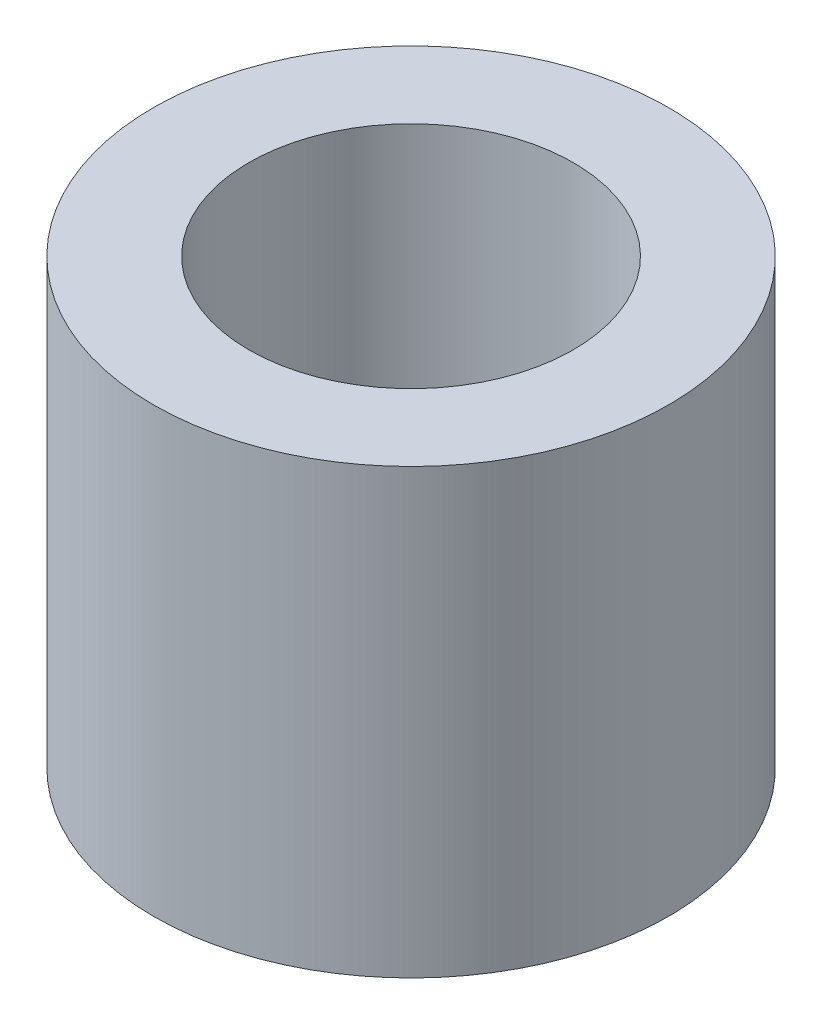
ISO-10303-21;
HEADER;
FILE_DESCRIPTION(('STEP AP214'),'2;1');
FILE_NAME('part.step','',(''),(''),'','','');
FILE_SCHEMA(('AUTOMOTIVE_DESIGN { 1 0 10303 214 1 1 1 1 }'));
ENDSEC;
DATA;
#1=APPLICATION_CONTEXT('core data for automotive mechanical design processes');
#2=APPLICATION_PROTOCOL_DEFINITION('international standard','automotive_design',2000,#1);
#3=PRODUCT_CONTEXT('',#1,'mechanical');
#4=PRODUCT('Part','Part','',(#3));
#5=PRODUCT_RELATED_PRODUCT_CATEGORY('part','',(#4));
#6=PRODUCT_DEFINITION_FORMATION('','',#4);
#7=PRODUCT_DEFINITION_CONTEXT('part definition',#1,'design');
#8=PRODUCT_DEFINITION('design','',#6,#7);
#9=PRODUCT_DEFINITION_SHAPE('','',#8);
#10=(LENGTH_UNIT() NAMED_UNIT(*) SI_UNIT(.MILLI.,.METRE.));
#11=(NAMED_UNIT(*) PLANE_ANGLE_UNIT() SI_UNIT($,.RADIAN.));
#12=(NAMED_UNIT(*) SI_UNIT($,.STERADIAN.) SOLID_ANGLE_UNIT());
#13=UNCERTAINTY_MEASURE_WITH_UNIT(LENGTH_MEASURE(1.E-05),#10,'distance_accuracy_value','');
#14=(GEOMETRIC_REPRESENTATION_CONTEXT(3) GLOBAL_UNCERTAINTY_ASSIGNED_CONTEXT((#13)) GLOBAL_UNIT_ASSIGNED_CONTEXT((#10,
#11,#12)) REPRESENTATION_CONTEXT('',''));
#15=CARTESIAN_POINT('',(0.,0.,0.));
#16=DIRECTION('',(0.,0.,1.));
#17=DIRECTION('',(1.,0.,0.));
#18=AXIS2_PLACEMENT_3D('',#15,#16,#17);
#19=CARTESIAN_POINT('',(0.,10.922,0.));
#20=DIRECTION('',(0.,1.,0.));
#21=DIRECTION('',(0.,0.,1.));
#22=AXIS2_PLACEMENT_3D('',#19,#20,#21);
#23=PLANE('',#22);
#24=CARTESIAN_POINT('',(0.,10.922,0.));
#25=DIRECTION('',(0.,1.,0.));
#26=DIRECTION('',(0.,0.,1.));
#27=AXIS2_PLACEMENT_3D('',#24,#25,#26);
#28=CIRCLE('',#27,6.35);
#29=CARTESIAN_POINT('',(0.,10.922,6.35));
#30=VERTEX_POINT('',#29);
#31=EDGE_CURVE('E12',#30,#30,#28,.T.);
#32=ORIENTED_EDGE('',*,*,#31,.T.);
#33=EDGE_LOOP('',(#32));
#34=FACE_BOUND('',#33,.T.);
#35=CARTESIAN_POINT('',(0.,10.922,0.));
#36=DIRECTION('',(0.,1.,0.));
#37=DIRECTION('',(0.,0.,1.));
#38=AXIS2_PLACEMENT_3D('',#35,#36,#37);
#39=CIRCLE('',#38,4.);
#40=CARTESIAN_POINT('',(0.,10.922,4.));
#41=VERTEX_POINT('',#40);
#42=EDGE_CURVE('E52',#41,#41,#39,.T.);
#43=ORIENTED_EDGE('',*,*,#42,.F.);
#44=EDGE_LOOP('',(#43));
#45=FACE_BOUND('',#44,.T.);
#46=ADVANCED_FACE('F41',(#34,#45),#23,.T.);
#47=CARTESIAN_POINT('',(0.,0.,0.));
#48=DIRECTION('',(0.,1.,0.));
#49=DIRECTION('',(0.,0.,1.));
#50=AXIS2_PLACEMENT_3D('',#47,#48,#49);
#51=PLANE('',#50);
#52=CARTESIAN_POINT('',(0.,0.,0.));
#53=DIRECTION('',(0.,1.,0.));
#54=DIRECTION('',(0.,0.,1.));
#55=AXIS2_PLACEMENT_3D('',#52,#53,#54);
#56=CIRCLE('',#55,6.35);
#57=CARTESIAN_POINT('',(0.,0.,6.35));
#58=VERTEX_POINT('',#57);
#59=EDGE_CURVE('E45',#58,#58,#56,.T.);
#60=ORIENTED_EDGE('',*,*,#59,.F.);
#61=EDGE_LOOP('',(#60));
#62=FACE_BOUND('',#61,.T.);
#63=CARTESIAN_POINT('',(0.,0.,0.));
#64=DIRECTION('',(0.,1.,0.));
#65=DIRECTION('',(0.,0.,1.));
#66=AXIS2_PLACEMENT_3D('',#63,#64,#65);
#67=CIRCLE('',#66,4.);
#68=CARTESIAN_POINT('',(0.,0.,4.));
#69=VERTEX_POINT('',#68);
#70=EDGE_CURVE('E54',#69,#69,#67,.T.);
#71=ORIENTED_EDGE('',*,*,#70,.T.);
#72=EDGE_LOOP('',(#71));
#73=FACE_BOUND('',#72,.T.);
#74=ADVANCED_FACE('F64',(#62,#73),#51,.F.);
#75=CARTESIAN_POINT('',(0.,10.922,0.));
#76=DIRECTION('',(0.,-1.,0.));
#77=DIRECTION('',(0.,0.,-1.));
#78=AXIS2_PLACEMENT_3D('',#75,#76,#77);
#79=CYLINDRICAL_SURFACE('',#78,6.35);
#80=ORIENTED_EDGE('',*,*,#31,.F.);
#81=EDGE_LOOP('',(#80));
#82=FACE_BOUND('',#81,.T.);
#83=ORIENTED_EDGE('',*,*,#59,.T.);
#84=EDGE_LOOP('',(#83));
#85=FACE_BOUND('',#84,.T.);
#86=ADVANCED_FACE('F43',(#82,#85),#79,.T.);
#87=CARTESIAN_POINT('',(0.,10.922,0.));
#88=DIRECTION('',(0.,-1.,0.));
#89=DIRECTION('',(0.,0.,-1.));
#90=AXIS2_PLACEMENT_3D('',#87,#88,#89);
#91=CYLINDRICAL_SURFACE('',#90,4.);
#92=ORIENTED_EDGE('',*,*,#42,.T.);
#93=EDGE_LOOP('',(#92));
#94=FACE_BOUND('',#93,.T.);
#95=ORIENTED_EDGE('',*,*,#70,.F.);
#96=EDGE_LOOP('',(#95));
#97=FACE_BOUND('',#96,.T.);
#98=ADVANCED_FACE('F60',(#94,#97),#91,.F.);
#99=CLOSED_SHELL('',(#46,#74,#86,#98));
#100=MANIFOLD_SOLID_BREP('B2',#99);
#101=ADVANCED_BREP_SHAPE_REPRESENTATION('',(#18,#100),#14);
#102=SHAPE_DEFINITION_REPRESENTATION(#9,#101);
ENDSEC;
END-ISO-10303-21;
